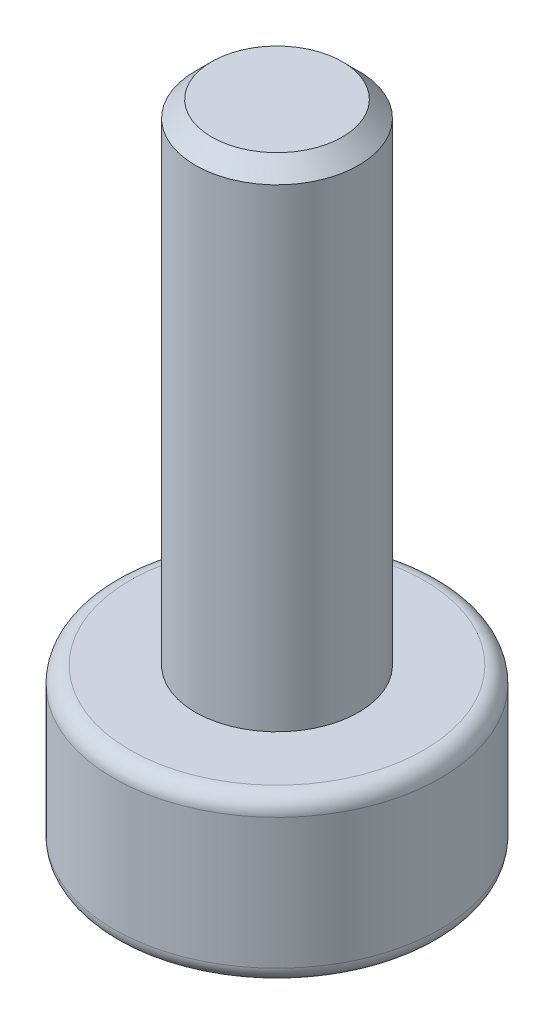
ISO-10303-21;
HEADER;
FILE_DESCRIPTION(('STEP AP214'),'2;1');
FILE_NAME('part.step','',(''),(''),'','','');
FILE_SCHEMA(('AUTOMOTIVE_DESIGN { 1 0 10303 214 1 1 1 1 }'));
ENDSEC;
DATA;
#1=APPLICATION_CONTEXT('core data for automotive mechanical design processes');
#2=APPLICATION_PROTOCOL_DEFINITION('international standard','automotive_design',2000,#1);
#3=PRODUCT_CONTEXT('',#1,'mechanical');
#4=PRODUCT('Part','Part','',(#3));
#5=PRODUCT_RELATED_PRODUCT_CATEGORY('part','',(#4));
#6=PRODUCT_DEFINITION_FORMATION('','',#4);
#7=PRODUCT_DEFINITION_CONTEXT('part definition',#1,'design');
#8=PRODUCT_DEFINITION('design','',#6,#7);
#9=PRODUCT_DEFINITION_SHAPE('','',#8);
#10=(LENGTH_UNIT() NAMED_UNIT(*) SI_UNIT(.MILLI.,.METRE.));
#11=(NAMED_UNIT(*) PLANE_ANGLE_UNIT() SI_UNIT($,.RADIAN.));
#12=(NAMED_UNIT(*) SI_UNIT($,.STERADIAN.) SOLID_ANGLE_UNIT());
#13=UNCERTAINTY_MEASURE_WITH_UNIT(LENGTH_MEASURE(1.E-05),#10,'distance_accuracy_value','');
#14=(GEOMETRIC_REPRESENTATION_CONTEXT(3) GLOBAL_UNCERTAINTY_ASSIGNED_CONTEXT((#13)) GLOBAL_UNIT_ASSIGNED_CONTEXT((#10,
#11,#12)) REPRESENTATION_CONTEXT('',''));
#15=CARTESIAN_POINT('',(0.,0.,0.));
#16=DIRECTION('',(0.,0.,1.));
#17=DIRECTION('',(1.,0.,0.));
#18=AXIS2_PLACEMENT_3D('',#15,#16,#17);
#19=CARTESIAN_POINT('',(0.,2.,0.));
#20=DIRECTION('',(0.,-1.,0.));
#21=DIRECTION('',(0.,0.,-1.));
#22=AXIS2_PLACEMENT_3D('',#19,#20,#21);
#23=CYLINDRICAL_SURFACE('',#22,2.);
#24=CARTESIAN_POINT('',(0.,0.2,0.));
#25=DIRECTION('',(0.,1.,0.));
#26=DIRECTION('',(0.,0.,1.));
#27=AXIS2_PLACEMENT_3D('',#24,#25,#26);
#28=CIRCLE('',#27,2.);
#29=CARTESIAN_POINT('',(0.,0.2,2.));
#30=VERTEX_POINT('',#29);
#31=EDGE_CURVE('E72',#30,#30,#28,.T.);
#32=ORIENTED_EDGE('',*,*,#31,.T.);
#33=EDGE_LOOP('',(#32));
#34=FACE_BOUND('',#33,.T.);
#35=CARTESIAN_POINT('',(0.,1.8,0.));
#36=DIRECTION('',(0.,1.,0.));
#37=DIRECTION('',(0.,0.,1.));
#38=AXIS2_PLACEMENT_3D('',#35,#36,#37);
#39=CIRCLE('',#38,2.);
#40=CARTESIAN_POINT('',(0.,1.8,2.));
#41=VERTEX_POINT('',#40);
#42=EDGE_CURVE('E76',#41,#41,#39,.F.);
#43=ORIENTED_EDGE('',*,*,#42,.T.);
#44=EDGE_LOOP('',(#43));
#45=FACE_BOUND('',#44,.T.);
#46=ADVANCED_FACE('F39',(#34,#45),#23,.T.);
#47=CARTESIAN_POINT('',(0.,2.,0.));
#48=DIRECTION('',(0.,1.,0.));
#49=DIRECTION('',(0.,0.,1.));
#50=AXIS2_PLACEMENT_3D('',#47,#48,#49);
#51=PLANE('',#50);
#52=CARTESIAN_POINT('',(0.,2.,0.));
#53=DIRECTION('',(0.,1.,0.));
#54=DIRECTION('',(0.,0.,1.));
#55=AXIS2_PLACEMENT_3D('',#52,#53,#54);
#56=CIRCLE('',#55,1.8);
#57=CARTESIAN_POINT('',(0.,2.,1.8));
#58=VERTEX_POINT('',#57);
#59=EDGE_CURVE('E64',#58,#58,#56,.T.);
#60=ORIENTED_EDGE('',*,*,#59,.T.);
#61=EDGE_LOOP('',(#60));
#62=FACE_BOUND('',#61,.T.);
#63=CARTESIAN_POINT('',(0.,2.,0.));
#64=DIRECTION('',(0.,1.,0.));
#65=DIRECTION('',(0.,0.,1.));
#66=AXIS2_PLACEMENT_3D('',#63,#64,#65);
#67=CIRCLE('',#66,1.);
#68=CARTESIAN_POINT('',(0.,2.,1.));
#69=VERTEX_POINT('',#68);
#70=EDGE_CURVE('E80',#69,#69,#67,.T.);
#71=ORIENTED_EDGE('',*,*,#70,.F.);
#72=EDGE_LOOP('',(#71));
#73=FACE_BOUND('',#72,.T.);
#74=ADVANCED_FACE('F107',(#62,#73),#51,.T.);
#75=CARTESIAN_POINT('',(0.,0.,0.));
#76=DIRECTION('',(0.,1.,0.));
#77=DIRECTION('',(0.,0.,1.));
#78=AXIS2_PLACEMENT_3D('',#75,#76,#77);
#79=PLANE('',#78);
#80=CARTESIAN_POINT('',(0.,0.,0.));
#81=DIRECTION('',(0.,1.,0.));
#82=DIRECTION('',(0.,0.,1.));
#83=AXIS2_PLACEMENT_3D('',#80,#81,#82);
#84=CIRCLE('',#83,0.864999999999998);
#85=CARTESIAN_POINT('',(0.,0.,0.864999999999998));
#86=VERTEX_POINT('',#85);
#87=EDGE_CURVE('E53',#86,#86,#84,.T.);
#88=ORIENTED_EDGE('',*,*,#87,.T.);
#89=EDGE_LOOP('',(#88));
#90=FACE_BOUND('',#89,.T.);
#91=CARTESIAN_POINT('',(0.,0.,0.));
#92=DIRECTION('',(0.,1.,0.));
#93=DIRECTION('',(0.,0.,1.));
#94=AXIS2_PLACEMENT_3D('',#91,#92,#93);
#95=CIRCLE('',#94,1.8);
#96=CARTESIAN_POINT('',(0.,0.,1.8));
#97=VERTEX_POINT('',#96);
#98=EDGE_CURVE('E68',#97,#97,#95,.F.);
#99=ORIENTED_EDGE('',*,*,#98,.T.);
#100=EDGE_LOOP('',(#99));
#101=FACE_BOUND('',#100,.T.);
#102=ADVANCED_FACE('F113',(#90,#101),#79,.F.);
#103=CARTESIAN_POINT('',(0.,8.,0.));
#104=DIRECTION('',(0.,-1.,0.));
#105=DIRECTION('',(0.,0.,-1.));
#106=AXIS2_PLACEMENT_3D('',#103,#104,#105);
#107=CYLINDRICAL_SURFACE('',#106,1.);
#108=CARTESIAN_POINT('',(0.,7.8,0.));
#109=DIRECTION('',(0.,1.,0.));
#110=DIRECTION('',(0.,0.,1.));
#111=AXIS2_PLACEMENT_3D('',#108,#109,#110);
#112=CIRCLE('',#111,1.);
#113=CARTESIAN_POINT('',(0.,7.8,1.));
#114=VERTEX_POINT('',#113);
#115=EDGE_CURVE('E10',#114,#114,#112,.F.);
#116=ORIENTED_EDGE('',*,*,#115,.T.);
#117=EDGE_LOOP('',(#116));
#118=FACE_BOUND('',#117,.T.);
#119=ORIENTED_EDGE('',*,*,#70,.T.);
#120=EDGE_LOOP('',(#119));
#121=FACE_BOUND('',#120,.T.);
#122=ADVANCED_FACE('F137',(#118,#121),#107,.T.);
#123=CARTESIAN_POINT('',(0.,8.,0.));
#124=DIRECTION('',(0.,1.,0.));
#125=DIRECTION('',(0.,0.,1.));
#126=AXIS2_PLACEMENT_3D('',#123,#124,#125);
#127=PLANE('',#126);
#128=CARTESIAN_POINT('',(0.,8.,0.));
#129=DIRECTION('',(0.,1.,0.));
#130=DIRECTION('',(0.,0.,1.));
#131=AXIS2_PLACEMENT_3D('',#128,#129,#130);
#132=CIRCLE('',#131,0.800000000000001);
#133=CARTESIAN_POINT('',(0.,8.,0.800000000000001));
#134=VERTEX_POINT('',#133);
#135=EDGE_CURVE('E48',#134,#134,#132,.T.);
#136=ORIENTED_EDGE('',*,*,#135,.T.);
#137=EDGE_LOOP('',(#136));
#138=FACE_BOUND('',#137,.T.);
#139=ADVANCED_FACE('F120',(#138),#127,.T.);
#140=CARTESIAN_POINT('',(0.,0.2,0.));
#141=DIRECTION('',(0.,1.,0.));
#142=DIRECTION('',(0.,0.,1.));
#143=AXIS2_PLACEMENT_3D('',#140,#141,#142);
#144=TOROIDAL_SURFACE('',#143,1.8,0.2);
#145=ORIENTED_EDGE('',*,*,#98,.F.);
#146=EDGE_LOOP('',(#145));
#147=FACE_BOUND('',#146,.T.);
#148=ORIENTED_EDGE('',*,*,#31,.F.);
#149=EDGE_LOOP('',(#148));
#150=FACE_BOUND('',#149,.T.);
#151=ADVANCED_FACE('F102',(#147,#150),#144,.T.);
#152=CARTESIAN_POINT('',(0.,1.8,0.));
#153=DIRECTION('',(0.,1.,0.));
#154=DIRECTION('',(0.,0.,1.));
#155=AXIS2_PLACEMENT_3D('',#152,#153,#154);
#156=TOROIDAL_SURFACE('',#155,1.8,0.2);
#157=ORIENTED_EDGE('',*,*,#42,.F.);
#158=EDGE_LOOP('',(#157));
#159=FACE_BOUND('',#158,.T.);
#160=ORIENTED_EDGE('',*,*,#59,.F.);
#161=EDGE_LOOP('',(#160));
#162=FACE_BOUND('',#161,.T.);
#163=ADVANCED_FACE('F93',(#159,#162),#156,.T.);
#164=CARTESIAN_POINT('',(0.,1.52,0.));
#165=DIRECTION('',(0.,-1.,0.));
#166=DIRECTION('',(0.,0.,-1.));
#167=AXIS2_PLACEMENT_3D('',#164,#165,#166);
#168=CYLINDRICAL_SURFACE('',#167,0.765);
#169=CARTESIAN_POINT('',(0.,0.0999999999999977,0.));
#170=DIRECTION('',(0.,1.,0.));
#171=DIRECTION('',(0.,0.,1.));
#172=AXIS2_PLACEMENT_3D('',#169,#170,#171);
#173=CIRCLE('',#172,0.765);
#174=CARTESIAN_POINT('',(0.,0.0999999999999977,0.765));
#175=VERTEX_POINT('',#174);
#176=EDGE_CURVE('E58',#175,#175,#173,.F.);
#177=ORIENTED_EDGE('',*,*,#176,.T.);
#178=EDGE_LOOP('',(#177));
#179=FACE_BOUND('',#178,.T.);
#180=CARTESIAN_POINT('',(0.,1.52,0.));
#181=DIRECTION('',(0.,-1.,0.));
#182=DIRECTION('',(0.,0.,-1.));
#183=AXIS2_PLACEMENT_3D('',#180,#181,#182);
#184=CIRCLE('',#183,0.765);
#185=CARTESIAN_POINT('',(0.,1.52,-0.765));
#186=VERTEX_POINT('',#185);
#187=EDGE_CURVE('E84',#186,#186,#184,.T.);
#188=ORIENTED_EDGE('',*,*,#187,.F.);
#189=EDGE_LOOP('',(#188));
#190=FACE_BOUND('',#189,.T.);
#191=ADVANCED_FACE('F91',(#179,#190),#168,.F.);
#192=CARTESIAN_POINT('',(0.,1.52,0.));
#193=DIRECTION('',(0.,-1.,0.));
#194=DIRECTION('',(0.,0.,-1.));
#195=AXIS2_PLACEMENT_3D('',#192,#193,#194);
#196=PLANE('',#195);
#197=ORIENTED_EDGE('',*,*,#187,.T.);
#198=EDGE_LOOP('',(#197));
#199=FACE_BOUND('',#198,.T.);
#200=ADVANCED_FACE('F89',(#199),#196,.T.);
#201=CARTESIAN_POINT('',(0.,0.0999999999999977,0.));
#202=DIRECTION('',(0.,-1.,0.));
#203=DIRECTION('',(0.,0.,-1.));
#204=AXIS2_PLACEMENT_3D('',#201,#202,#203);
#205=CONICAL_SURFACE('',#204,0.765,0.785398163397452);
#206=ORIENTED_EDGE('',*,*,#87,.F.);
#207=EDGE_LOOP('',(#206));
#208=FACE_BOUND('',#207,.T.);
#209=ORIENTED_EDGE('',*,*,#176,.F.);
#210=EDGE_LOOP('',(#209));
#211=FACE_BOUND('',#210,.T.);
#212=ADVANCED_FACE('F100',(#208,#211),#205,.F.);
#213=CARTESIAN_POINT('',(0.,8.,0.));
#214=DIRECTION('',(0.,-1.,0.));
#215=DIRECTION('',(0.,0.,-1.));
#216=AXIS2_PLACEMENT_3D('',#213,#214,#215);
#217=CONICAL_SURFACE('',#216,0.800000000000001,0.785398163397453);
#218=ORIENTED_EDGE('',*,*,#115,.F.);
#219=EDGE_LOOP('',(#218));
#220=FACE_BOUND('',#219,.T.);
#221=ORIENTED_EDGE('',*,*,#135,.F.);
#222=EDGE_LOOP('',(#221));
#223=FACE_BOUND('',#222,.T.);
#224=ADVANCED_FACE('F42',(#220,#223),#217,.T.);
#225=CLOSED_SHELL('',(#46,#74,#102,#122,#139,#151,#163,#191,#200,#212,#224));
#226=MANIFOLD_SOLID_BREP('B2',#225);
#227=ADVANCED_BREP_SHAPE_REPRESENTATION('',(#18,#226),#14);
#228=SHAPE_DEFINITION_REPRESENTATION(#9,#227);
ENDSEC;
END-ISO-10303-21;
